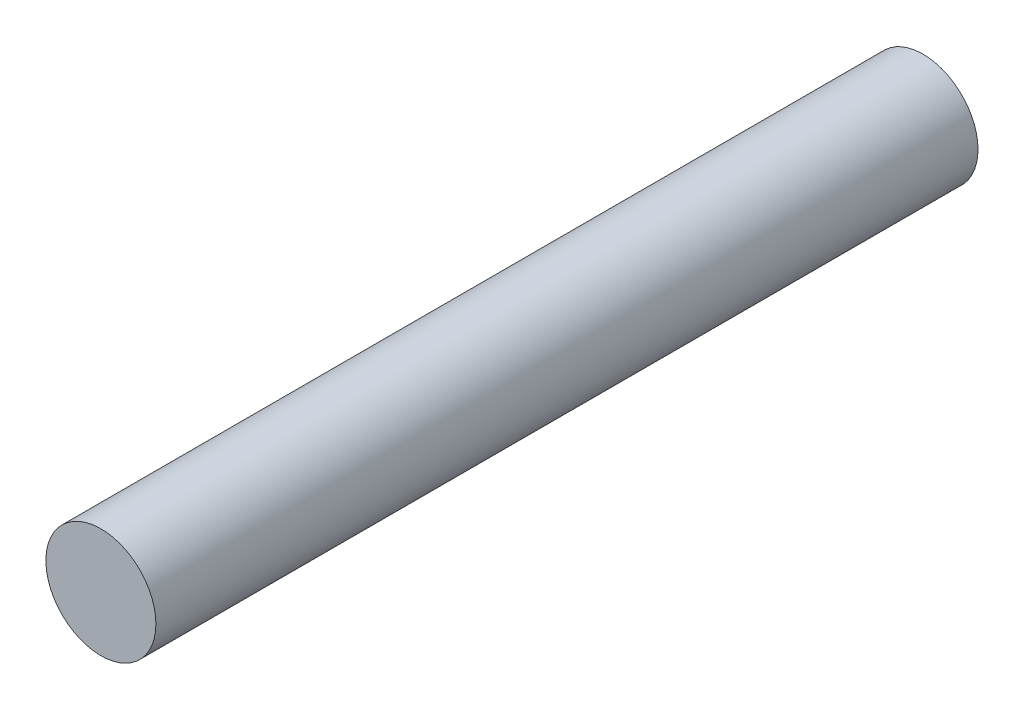
ISO-10303-21;
HEADER;
FILE_DESCRIPTION(('STEP AP214'),'2;1');
FILE_NAME('part.step','',(''),(''),'','','');
FILE_SCHEMA(('AUTOMOTIVE_DESIGN { 1 0 10303 214 1 1 1 1 }'));
ENDSEC;
DATA;
#1=APPLICATION_CONTEXT('core data for automotive mechanical design processes');
#2=APPLICATION_PROTOCOL_DEFINITION('international standard','automotive_design',2000,#1);
#3=PRODUCT_CONTEXT('',#1,'mechanical');
#4=PRODUCT('Part','Part','',(#3));
#5=PRODUCT_RELATED_PRODUCT_CATEGORY('part','',(#4));
#6=PRODUCT_DEFINITION_FORMATION('','',#4);
#7=PRODUCT_DEFINITION_CONTEXT('part definition',#1,'design');
#8=PRODUCT_DEFINITION('design','',#6,#7);
#9=PRODUCT_DEFINITION_SHAPE('','',#8);
#10=(LENGTH_UNIT() NAMED_UNIT(*) SI_UNIT(.MILLI.,.METRE.));
#11=(NAMED_UNIT(*) PLANE_ANGLE_UNIT() SI_UNIT($,.RADIAN.));
#12=(NAMED_UNIT(*) SI_UNIT($,.STERADIAN.) SOLID_ANGLE_UNIT());
#13=UNCERTAINTY_MEASURE_WITH_UNIT(LENGTH_MEASURE(1.E-05),#10,'distance_accuracy_value','');
#14=(GEOMETRIC_REPRESENTATION_CONTEXT(3) GLOBAL_UNCERTAINTY_ASSIGNED_CONTEXT((#13)) GLOBAL_UNIT_ASSIGNED_CONTEXT((#10,
#11,#12)) REPRESENTATION_CONTEXT('',''));
#15=CARTESIAN_POINT('',(0.,0.,0.));
#16=DIRECTION('',(0.,0.,1.));
#17=DIRECTION('',(1.,0.,0.));
#18=AXIS2_PLACEMENT_3D('',#15,#16,#17);
#19=CARTESIAN_POINT('',(0.,0.,14.2));
#20=DIRECTION('',(0.,0.,-1.));
#21=DIRECTION('',(-1.,0.,0.));
#22=AXIS2_PLACEMENT_3D('',#19,#20,#21);
#23=CYLINDRICAL_SURFACE('',#22,0.95);
#24=CARTESIAN_POINT('',(0.,0.,14.2));
#25=DIRECTION('',(0.,0.,1.));
#26=DIRECTION('',(1.,0.,0.));
#27=AXIS2_PLACEMENT_3D('',#24,#25,#26);
#28=CIRCLE('',#27,0.95);
#29=CARTESIAN_POINT('',(0.95,0.,14.2));
#30=VERTEX_POINT('',#29);
#31=EDGE_CURVE('E10',#30,#30,#28,.T.);
#32=ORIENTED_EDGE('',*,*,#31,.F.);
#33=EDGE_LOOP('',(#32));
#34=FACE_BOUND('',#33,.T.);
#35=CARTESIAN_POINT('',(0.,0.,0.));
#36=DIRECTION('',(0.,0.,1.));
#37=DIRECTION('',(1.,0.,0.));
#38=AXIS2_PLACEMENT_3D('',#35,#36,#37);
#39=CIRCLE('',#38,0.95);
#40=CARTESIAN_POINT('',(0.95,0.,0.));
#41=VERTEX_POINT('',#40);
#42=EDGE_CURVE('E40',#41,#41,#39,.T.);
#43=ORIENTED_EDGE('',*,*,#42,.T.);
#44=EDGE_LOOP('',(#43));
#45=FACE_BOUND('',#44,.T.);
#46=ADVANCED_FACE('F37',(#34,#45),#23,.T.);
#47=CARTESIAN_POINT('',(0.,0.,14.2));
#48=DIRECTION('',(0.,0.,1.));
#49=DIRECTION('',(1.,0.,0.));
#50=AXIS2_PLACEMENT_3D('',#47,#48,#49);
#51=PLANE('',#50);
#52=ORIENTED_EDGE('',*,*,#31,.T.);
#53=EDGE_LOOP('',(#52));
#54=FACE_BOUND('',#53,.T.);
#55=ADVANCED_FACE('F54',(#54),#51,.T.);
#56=CARTESIAN_POINT('',(0.,0.,0.));
#57=DIRECTION('',(0.,0.,1.));
#58=DIRECTION('',(1.,0.,0.));
#59=AXIS2_PLACEMENT_3D('',#56,#57,#58);
#60=PLANE('',#59);
#61=ORIENTED_EDGE('',*,*,#42,.F.);
#62=EDGE_LOOP('',(#61));
#63=FACE_BOUND('',#62,.T.);
#64=ADVANCED_FACE('F52',(#63),#60,.F.);
#65=CLOSED_SHELL('',(#46,#55,#64));
#66=MANIFOLD_SOLID_BREP('B2',#65);
#67=ADVANCED_BREP_SHAPE_REPRESENTATION('',(#18,#66),#14);
#68=SHAPE_DEFINITION_REPRESENTATION(#9,#67);
ENDSEC;
END-ISO-10303-21;
